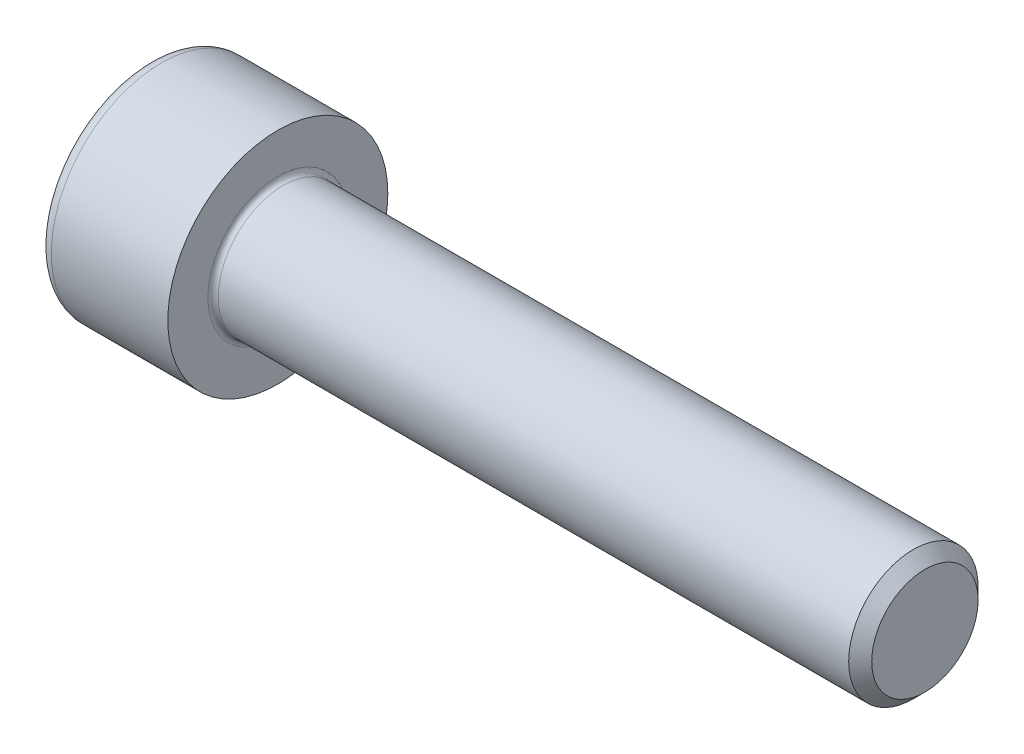
ISO-10303-21;
HEADER;
FILE_DESCRIPTION(('STEP AP214'),'2;1');
FILE_NAME('part.step','',(''),(''),'','','');
FILE_SCHEMA(('AUTOMOTIVE_DESIGN { 1 0 10303 214 1 1 1 1 }'));
ENDSEC;
DATA;
#1=APPLICATION_CONTEXT('core data for automotive mechanical design processes');
#2=APPLICATION_PROTOCOL_DEFINITION('international standard','automotive_design',2000,#1);
#3=PRODUCT_CONTEXT('',#1,'mechanical');
#4=PRODUCT('Part','Part','',(#3));
#5=PRODUCT_RELATED_PRODUCT_CATEGORY('part','',(#4));
#6=PRODUCT_DEFINITION_FORMATION('','',#4);
#7=PRODUCT_DEFINITION_CONTEXT('part definition',#1,'design');
#8=PRODUCT_DEFINITION('design','',#6,#7);
#9=PRODUCT_DEFINITION_SHAPE('','',#8);
#10=(LENGTH_UNIT() NAMED_UNIT(*) SI_UNIT(.MILLI.,.METRE.));
#11=(NAMED_UNIT(*) PLANE_ANGLE_UNIT() SI_UNIT($,.RADIAN.));
#12=(NAMED_UNIT(*) SI_UNIT($,.STERADIAN.) SOLID_ANGLE_UNIT());
#13=UNCERTAINTY_MEASURE_WITH_UNIT(LENGTH_MEASURE(1.E-05),#10,'distance_accuracy_value','');
#14=(GEOMETRIC_REPRESENTATION_CONTEXT(3) GLOBAL_UNCERTAINTY_ASSIGNED_CONTEXT((#13)) GLOBAL_UNIT_ASSIGNED_CONTEXT((#10,
#11,#12)) REPRESENTATION_CONTEXT('',''));
#15=CARTESIAN_POINT('',(0.,0.,0.));
#16=DIRECTION('',(0.,0.,1.));
#17=DIRECTION('',(1.,0.,0.));
#18=AXIS2_PLACEMENT_3D('',#15,#16,#17);
#19=CARTESIAN_POINT('',(2.5,3.46410161513776,2.));
#20=DIRECTION('',(1.,0.,0.));
#21=DIRECTION('',(0.,0.,-1.));
#22=AXIS2_PLACEMENT_3D('',#19,#20,#21);
#23=PLANE('',#22);
#24=CARTESIAN_POINT('',(2.5,0.,0.));
#25=DIRECTION('',(1.,0.,0.));
#26=DIRECTION('',(0.,0.,-1.));
#27=AXIS2_PLACEMENT_3D('',#24,#25,#26);
#28=CIRCLE('',#27,2.);
#29=CARTESIAN_POINT('',(2.5,0.,-2.));
#30=VERTEX_POINT('',#29);
#31=CARTESIAN_POINT('',(2.5,-1.73205080756888,-0.999999999999999));
#32=VERTEX_POINT('',#31);
#33=EDGE_CURVE('E157',#30,#32,#28,.F.);
#34=ORIENTED_EDGE('',*,*,#33,.F.);
#35=DIRECTION('',(0.,1.,0.));
#36=VECTOR('',#35,1.);
#37=CARTESIAN_POINT('',(2.5,-1.15470053837925,-2.));
#38=LINE('',#37,#36);
#39=CARTESIAN_POINT('',(2.5,-1.15470053837925,-2.));
#40=VERTEX_POINT('',#39);
#41=EDGE_CURVE('E188',#40,#30,#38,.T.);
#42=ORIENTED_EDGE('',*,*,#41,.F.);
#43=DIRECTION('',(0.,0.5,-0.866025403784439));
#44=VECTOR('',#43,1.);
#45=CARTESIAN_POINT('',(2.5,-2.3094010767585,0.));
#46=LINE('',#45,#44);
#47=EDGE_CURVE('E184',#32,#40,#46,.T.);
#48=ORIENTED_EDGE('',*,*,#47,.F.);
#49=EDGE_LOOP('',(#34,#42,#48));
#50=FACE_BOUND('',#49,.T.);
#51=ADVANCED_FACE('F35',(#50),#23,.F.);
#52=CARTESIAN_POINT('',(2.5,-1.73205080756888,1.));
#53=VERTEX_POINT('',#52);
#54=EDGE_CURVE('E263',#32,#53,#28,.F.);
#55=ORIENTED_EDGE('',*,*,#54,.F.);
#56=CARTESIAN_POINT('',(2.5,-2.3094010767585,0.));
#57=VERTEX_POINT('',#56);
#58=EDGE_CURVE('E185',#57,#32,#46,.T.);
#59=ORIENTED_EDGE('',*,*,#58,.F.);
#60=DIRECTION('',(0.,-0.5,-0.866025403784439));
#61=VECTOR('',#60,1.);
#62=CARTESIAN_POINT('',(2.5,-1.15470053837925,2.));
#63=LINE('',#62,#61);
#64=EDGE_CURVE('E180',#53,#57,#63,.T.);
#65=ORIENTED_EDGE('',*,*,#64,.F.);
#66=EDGE_LOOP('',(#55,#59,#65));
#67=FACE_BOUND('',#66,.T.);
#68=ADVANCED_FACE('F123',(#67),#23,.F.);
#69=CARTESIAN_POINT('',(2.5,0.,2.));
#70=VERTEX_POINT('',#69);
#71=EDGE_CURVE('E264',#53,#70,#28,.F.);
#72=ORIENTED_EDGE('',*,*,#71,.F.);
#73=CARTESIAN_POINT('',(2.5,-1.15470053837925,2.));
#74=VERTEX_POINT('',#73);
#75=EDGE_CURVE('E181',#74,#53,#63,.T.);
#76=ORIENTED_EDGE('',*,*,#75,.F.);
#77=DIRECTION('',(0.,-1.,0.));
#78=VECTOR('',#77,1.);
#79=CARTESIAN_POINT('',(2.5,1.15470053837925,2.));
#80=LINE('',#79,#78);
#81=EDGE_CURVE('E176',#70,#74,#80,.T.);
#82=ORIENTED_EDGE('',*,*,#81,.F.);
#83=EDGE_LOOP('',(#72,#76,#82));
#84=FACE_BOUND('',#83,.T.);
#85=ADVANCED_FACE('F130',(#84),#23,.F.);
#86=CARTESIAN_POINT('',(2.5,1.73205080756888,1.));
#87=VERTEX_POINT('',#86);
#88=EDGE_CURVE('E266',#70,#87,#28,.F.);
#89=ORIENTED_EDGE('',*,*,#88,.F.);
#90=CARTESIAN_POINT('',(2.5,1.15470053837925,2.));
#91=VERTEX_POINT('',#90);
#92=EDGE_CURVE('E177',#91,#70,#80,.T.);
#93=ORIENTED_EDGE('',*,*,#92,.F.);
#94=DIRECTION('',(0.,-0.5,0.866025403784439));
#95=VECTOR('',#94,1.);
#96=CARTESIAN_POINT('',(2.5,2.3094010767585,0.));
#97=LINE('',#96,#95);
#98=EDGE_CURVE('E171',#87,#91,#97,.T.);
#99=ORIENTED_EDGE('',*,*,#98,.F.);
#100=EDGE_LOOP('',(#89,#93,#99));
#101=FACE_BOUND('',#100,.T.);
#102=ADVANCED_FACE('F145',(#101),#23,.F.);
#103=CARTESIAN_POINT('',(2.5,1.73205080756888,-1.));
#104=VERTEX_POINT('',#103);
#105=EDGE_CURVE('E50',#87,#104,#28,.F.);
#106=ORIENTED_EDGE('',*,*,#105,.F.);
#107=CARTESIAN_POINT('',(2.5,2.3094010767585,0.));
#108=VERTEX_POINT('',#107);
#109=EDGE_CURVE('E162',#108,#87,#97,.T.);
#110=ORIENTED_EDGE('',*,*,#109,.F.);
#111=DIRECTION('',(0.,0.5,0.866025403784439));
#112=VECTOR('',#111,1.);
#113=CARTESIAN_POINT('',(2.5,1.15470053837925,-2.));
#114=LINE('',#113,#112);
#115=EDGE_CURVE('E159',#104,#108,#114,.T.);
#116=ORIENTED_EDGE('',*,*,#115,.F.);
#117=EDGE_LOOP('',(#106,#110,#116));
#118=FACE_BOUND('',#117,.T.);
#119=ADVANCED_FACE('F136',(#118),#23,.F.);
#120=EDGE_CURVE('E149',#104,#30,#28,.F.);
#121=ORIENTED_EDGE('',*,*,#120,.F.);
#122=CARTESIAN_POINT('',(2.5,1.15470053837925,-2.));
#123=VERTEX_POINT('',#122);
#124=EDGE_CURVE('E152',#123,#104,#114,.T.);
#125=ORIENTED_EDGE('',*,*,#124,.F.);
#126=EDGE_CURVE('E153',#30,#123,#38,.T.);
#127=ORIENTED_EDGE('',*,*,#126,.F.);
#128=EDGE_LOOP('',(#121,#125,#127));
#129=FACE_BOUND('',#128,.T.);
#130=ADVANCED_FACE('F126',(#129),#23,.F.);
#131=CARTESIAN_POINT('',(0.,0.,0.));
#132=DIRECTION('',(1.,0.,0.));
#133=DIRECTION('',(0.,0.,-1.));
#134=AXIS2_PLACEMENT_3D('',#131,#132,#133);
#135=PLANE('',#134);
#136=CARTESIAN_POINT('',(0.,0.,0.));
#137=DIRECTION('',(1.,0.,0.));
#138=DIRECTION('',(0.,0.,-1.));
#139=AXIS2_PLACEMENT_3D('',#136,#137,#138);
#140=CIRCLE('',#139,3.75);
#141=CARTESIAN_POINT('',(0.,0.,-3.75));
#142=VERTEX_POINT('',#141);
#143=EDGE_CURVE('E11',#142,#142,#140,.F.);
#144=ORIENTED_EDGE('',*,*,#143,.T.);
#145=EDGE_LOOP('',(#144));
#146=FACE_BOUND('',#145,.T.);
#147=DIRECTION('',(0.,0.5,0.866025403784439));
#148=VECTOR('',#147,1.);
#149=CARTESIAN_POINT('',(0.,1.15470053837925,-2.));
#150=LINE('',#149,#148);
#151=CARTESIAN_POINT('',(0.,1.15470053837925,-2.));
#152=VERTEX_POINT('',#151);
#153=CARTESIAN_POINT('',(0.,2.3094010767585,0.));
#154=VERTEX_POINT('',#153);
#155=EDGE_CURVE('E190',#152,#154,#150,.T.);
#156=ORIENTED_EDGE('',*,*,#155,.T.);
#157=DIRECTION('',(0.,-0.5,0.866025403784439));
#158=VECTOR('',#157,1.);
#159=CARTESIAN_POINT('',(0.,2.3094010767585,0.));
#160=LINE('',#159,#158);
#161=CARTESIAN_POINT('',(0.,1.15470053837925,2.));
#162=VERTEX_POINT('',#161);
#163=EDGE_CURVE('E192',#154,#162,#160,.T.);
#164=ORIENTED_EDGE('',*,*,#163,.T.);
#165=DIRECTION('',(0.,-1.,0.));
#166=VECTOR('',#165,1.);
#167=CARTESIAN_POINT('',(0.,1.15470053837925,2.));
#168=LINE('',#167,#166);
#169=CARTESIAN_POINT('',(0.,-1.15470053837925,2.));
#170=VERTEX_POINT('',#169);
#171=EDGE_CURVE('E194',#162,#170,#168,.T.);
#172=ORIENTED_EDGE('',*,*,#171,.T.);
#173=DIRECTION('',(0.,-0.5,-0.866025403784439));
#174=VECTOR('',#173,1.);
#175=CARTESIAN_POINT('',(0.,-1.15470053837925,2.));
#176=LINE('',#175,#174);
#177=CARTESIAN_POINT('',(0.,-2.3094010767585,0.));
#178=VERTEX_POINT('',#177);
#179=EDGE_CURVE('E196',#170,#178,#176,.T.);
#180=ORIENTED_EDGE('',*,*,#179,.T.);
#181=DIRECTION('',(0.,0.5,-0.866025403784439));
#182=VECTOR('',#181,1.);
#183=CARTESIAN_POINT('',(0.,-2.3094010767585,0.));
#184=LINE('',#183,#182);
#185=CARTESIAN_POINT('',(0.,-1.15470053837925,-2.));
#186=VERTEX_POINT('',#185);
#187=EDGE_CURVE('E198',#178,#186,#184,.T.);
#188=ORIENTED_EDGE('',*,*,#187,.T.);
#189=DIRECTION('',(0.,1.,0.));
#190=VECTOR('',#189,1.);
#191=CARTESIAN_POINT('',(0.,-1.15470053837925,-2.));
#192=LINE('',#191,#190);
#193=EDGE_CURVE('E58',#186,#152,#192,.T.);
#194=ORIENTED_EDGE('',*,*,#193,.T.);
#195=EDGE_LOOP('',(#156,#164,#172,#180,#188,#194));
#196=FACE_BOUND('',#195,.T.);
#197=ADVANCED_FACE('F135',(#146,#196),#135,.F.);
#198=CARTESIAN_POINT('',(5.,0.,0.));
#199=DIRECTION('',(1.,0.,0.));
#200=DIRECTION('',(0.,0.,-1.));
#201=AXIS2_PLACEMENT_3D('',#198,#199,#200);
#202=PLANE('',#201);
#203=CARTESIAN_POINT('',(5.,0.,0.));
#204=DIRECTION('',(1.,0.,0.));
#205=DIRECTION('',(0.,0.,-1.));
#206=AXIS2_PLACEMENT_3D('',#203,#204,#205);
#207=CIRCLE('',#206,2.7);
#208=CARTESIAN_POINT('',(5.,0.,-2.7));
#209=VERTEX_POINT('',#208);
#210=EDGE_CURVE('E224',#209,#209,#207,.F.);
#211=ORIENTED_EDGE('',*,*,#210,.T.);
#212=EDGE_LOOP('',(#211));
#213=FACE_BOUND('',#212,.T.);
#214=CARTESIAN_POINT('',(5.,0.,0.));
#215=DIRECTION('',(1.,0.,0.));
#216=DIRECTION('',(0.,0.,-1.));
#217=AXIS2_PLACEMENT_3D('',#214,#215,#216);
#218=CIRCLE('',#217,4.25);
#219=CARTESIAN_POINT('',(5.,0.,-4.25));
#220=VERTEX_POINT('',#219);
#221=EDGE_CURVE('E155',#220,#220,#218,.T.);
#222=ORIENTED_EDGE('',*,*,#221,.T.);
#223=EDGE_LOOP('',(#222));
#224=FACE_BOUND('',#223,.T.);
#225=ADVANCED_FACE('F142',(#213,#224),#202,.T.);
#226=CARTESIAN_POINT('',(5.,0.,0.));
#227=DIRECTION('',(-1.,0.,0.));
#228=DIRECTION('',(0.,0.,1.));
#229=AXIS2_PLACEMENT_3D('',#226,#227,#228);
#230=CYLINDRICAL_SURFACE('',#229,4.25);
#231=CARTESIAN_POINT('',(0.5,0.,0.));
#232=DIRECTION('',(1.,0.,0.));
#233=DIRECTION('',(0.,0.,-1.));
#234=AXIS2_PLACEMENT_3D('',#231,#232,#233);
#235=CIRCLE('',#234,4.25);
#236=CARTESIAN_POINT('',(0.5,0.,-4.25));
#237=VERTEX_POINT('',#236);
#238=EDGE_CURVE('E43',#237,#237,#235,.T.);
#239=ORIENTED_EDGE('',*,*,#238,.T.);
#240=EDGE_LOOP('',(#239));
#241=FACE_BOUND('',#240,.T.);
#242=ORIENTED_EDGE('',*,*,#221,.F.);
#243=EDGE_LOOP('',(#242));
#244=FACE_BOUND('',#243,.T.);
#245=ADVANCED_FACE('F232',(#241,#244),#230,.T.);
#246=CARTESIAN_POINT('',(30.,0.,0.));
#247=DIRECTION('',(-1.,0.,0.));
#248=DIRECTION('',(0.,0.,1.));
#249=AXIS2_PLACEMENT_3D('',#246,#247,#248);
#250=PLANE('',#249);
#251=CARTESIAN_POINT('',(30.,0.,0.));
#252=DIRECTION('',(-1.,0.,0.));
#253=DIRECTION('',(0.,0.,1.));
#254=AXIS2_PLACEMENT_3D('',#251,#252,#253);
#255=CIRCLE('',#254,2.055);
#256=CARTESIAN_POINT('',(30.,0.,2.055));
#257=VERTEX_POINT('',#256);
#258=EDGE_CURVE('E219',#257,#257,#255,.T.);
#259=ORIENTED_EDGE('',*,*,#258,.F.);
#260=EDGE_LOOP('',(#259));
#261=FACE_BOUND('',#260,.T.);
#262=ADVANCED_FACE('F389',(#261),#250,.F.);
#263=CARTESIAN_POINT('',(30.,0.,0.));
#264=DIRECTION('',(-1.,0.,0.));
#265=DIRECTION('',(0.,0.,1.));
#266=AXIS2_PLACEMENT_3D('',#263,#264,#265);
#267=CONICAL_SURFACE('',#266,2.055,0.785398163397445);
#268=CARTESIAN_POINT('',(29.555,0.,0.));
#269=DIRECTION('',(-1.,0.,0.));
#270=DIRECTION('',(0.,0.,1.));
#271=AXIS2_PLACEMENT_3D('',#268,#269,#270);
#272=CIRCLE('',#271,2.5);
#273=CARTESIAN_POINT('',(29.555,0.,2.5));
#274=VERTEX_POINT('',#273);
#275=EDGE_CURVE('E216',#274,#274,#272,.T.);
#276=ORIENTED_EDGE('',*,*,#275,.F.);
#277=EDGE_LOOP('',(#276));
#278=FACE_BOUND('',#277,.T.);
#279=ORIENTED_EDGE('',*,*,#258,.T.);
#280=EDGE_LOOP('',(#279));
#281=FACE_BOUND('',#280,.T.);
#282=ADVANCED_FACE('F369',(#278,#281),#267,.T.);
#283=CARTESIAN_POINT('',(0.,0.,0.));
#284=DIRECTION('',(-1.,0.,0.));
#285=DIRECTION('',(0.,0.,1.));
#286=AXIS2_PLACEMENT_3D('',#283,#284,#285);
#287=CYLINDRICAL_SURFACE('',#286,2.5);
#288=CARTESIAN_POINT('',(5.2,0.,0.));
#289=DIRECTION('',(1.,0.,0.));
#290=DIRECTION('',(0.,0.,-1.));
#291=AXIS2_PLACEMENT_3D('',#288,#289,#290);
#292=CIRCLE('',#291,2.5);
#293=CARTESIAN_POINT('',(5.2,0.,-2.5));
#294=VERTEX_POINT('',#293);
#295=EDGE_CURVE('E227',#294,#294,#292,.T.);
#296=ORIENTED_EDGE('',*,*,#295,.T.);
#297=EDGE_LOOP('',(#296));
#298=FACE_BOUND('',#297,.T.);
#299=ORIENTED_EDGE('',*,*,#275,.T.);
#300=EDGE_LOOP('',(#299));
#301=FACE_BOUND('',#300,.T.);
#302=ADVANCED_FACE('F296',(#298,#301),#287,.T.);
#303=CARTESIAN_POINT('',(2.5,1.15470053837925,-2.));
#304=DIRECTION('',(0.,-0.866025403784439,0.5));
#305=DIRECTION('',(0.,-0.5,-0.866025403784439));
#306=AXIS2_PLACEMENT_3D('',#303,#304,#305);
#307=PLANE('',#306);
#308=ORIENTED_EDGE('',*,*,#124,.T.);
#309=ORIENTED_EDGE('',*,*,#115,.T.);
#310=DIRECTION('',(-1.,0.,0.));
#311=VECTOR('',#310,1.);
#312=CARTESIAN_POINT('',(2.5,2.3094010767585,0.));
#313=LINE('',#312,#311);
#314=EDGE_CURVE('E214',#108,#154,#313,.T.);
#315=ORIENTED_EDGE('',*,*,#314,.T.);
#316=ORIENTED_EDGE('',*,*,#155,.F.);
#317=DIRECTION('',(-1.,0.,0.));
#318=VECTOR('',#317,1.);
#319=CARTESIAN_POINT('',(2.5,1.15470053837925,-2.));
#320=LINE('',#319,#318);
#321=EDGE_CURVE('E170',#123,#152,#320,.T.);
#322=ORIENTED_EDGE('',*,*,#321,.F.);
#323=EDGE_LOOP('',(#308,#309,#315,#316,#322));
#324=FACE_BOUND('',#323,.T.);
#325=ADVANCED_FACE('F168',(#324),#307,.T.);
#326=CARTESIAN_POINT('',(2.5,2.3094010767585,0.));
#327=DIRECTION('',(0.,-0.866025403784439,-0.5));
#328=DIRECTION('',(0.,0.5,-0.866025403784439));
#329=AXIS2_PLACEMENT_3D('',#326,#327,#328);
#330=PLANE('',#329);
#331=ORIENTED_EDGE('',*,*,#109,.T.);
#332=ORIENTED_EDGE('',*,*,#98,.T.);
#333=DIRECTION('',(-1.,0.,0.));
#334=VECTOR('',#333,1.);
#335=CARTESIAN_POINT('',(2.5,1.15470053837925,2.));
#336=LINE('',#335,#334);
#337=EDGE_CURVE('E211',#91,#162,#336,.T.);
#338=ORIENTED_EDGE('',*,*,#337,.T.);
#339=ORIENTED_EDGE('',*,*,#163,.F.);
#340=ORIENTED_EDGE('',*,*,#314,.F.);
#341=EDGE_LOOP('',(#331,#332,#338,#339,#340));
#342=FACE_BOUND('',#341,.T.);
#343=ADVANCED_FACE('F242',(#342),#330,.T.);
#344=CARTESIAN_POINT('',(2.5,1.15470053837925,2.));
#345=DIRECTION('',(0.,0.,-1.));
#346=DIRECTION('',(-1.,0.,0.));
#347=AXIS2_PLACEMENT_3D('',#344,#345,#346);
#348=PLANE('',#347);
#349=ORIENTED_EDGE('',*,*,#92,.T.);
#350=ORIENTED_EDGE('',*,*,#81,.T.);
#351=DIRECTION('',(-1.,0.,0.));
#352=VECTOR('',#351,1.);
#353=CARTESIAN_POINT('',(2.5,-1.15470053837925,2.));
#354=LINE('',#353,#352);
#355=EDGE_CURVE('E208',#74,#170,#354,.T.);
#356=ORIENTED_EDGE('',*,*,#355,.T.);
#357=ORIENTED_EDGE('',*,*,#171,.F.);
#358=ORIENTED_EDGE('',*,*,#337,.F.);
#359=EDGE_LOOP('',(#349,#350,#356,#357,#358));
#360=FACE_BOUND('',#359,.T.);
#361=ADVANCED_FACE('F247',(#360),#348,.T.);
#362=CARTESIAN_POINT('',(2.5,-1.15470053837925,2.));
#363=DIRECTION('',(0.,0.866025403784439,-0.5));
#364=DIRECTION('',(0.,0.5,0.866025403784439));
#365=AXIS2_PLACEMENT_3D('',#362,#363,#364);
#366=PLANE('',#365);
#367=ORIENTED_EDGE('',*,*,#75,.T.);
#368=ORIENTED_EDGE('',*,*,#64,.T.);
#369=DIRECTION('',(-1.,0.,0.));
#370=VECTOR('',#369,1.);
#371=CARTESIAN_POINT('',(2.5,-2.3094010767585,0.));
#372=LINE('',#371,#370);
#373=EDGE_CURVE('E205',#57,#178,#372,.T.);
#374=ORIENTED_EDGE('',*,*,#373,.T.);
#375=ORIENTED_EDGE('',*,*,#179,.F.);
#376=ORIENTED_EDGE('',*,*,#355,.F.);
#377=EDGE_LOOP('',(#367,#368,#374,#375,#376));
#378=FACE_BOUND('',#377,.T.);
#379=ADVANCED_FACE('F253',(#378),#366,.T.);
#380=CARTESIAN_POINT('',(2.5,-2.3094010767585,0.));
#381=DIRECTION('',(0.,0.866025403784439,0.5));
#382=DIRECTION('',(0.,-0.5,0.866025403784439));
#383=AXIS2_PLACEMENT_3D('',#380,#381,#382);
#384=PLANE('',#383);
#385=ORIENTED_EDGE('',*,*,#58,.T.);
#386=ORIENTED_EDGE('',*,*,#47,.T.);
#387=DIRECTION('',(-1.,0.,0.));
#388=VECTOR('',#387,1.);
#389=CARTESIAN_POINT('',(2.5,-1.15470053837925,-2.));
#390=LINE('',#389,#388);
#391=EDGE_CURVE('E202',#40,#186,#390,.T.);
#392=ORIENTED_EDGE('',*,*,#391,.T.);
#393=ORIENTED_EDGE('',*,*,#187,.F.);
#394=ORIENTED_EDGE('',*,*,#373,.F.);
#395=EDGE_LOOP('',(#385,#386,#392,#393,#394));
#396=FACE_BOUND('',#395,.T.);
#397=ADVANCED_FACE('F257',(#396),#384,.T.);
#398=CARTESIAN_POINT('',(2.5,-1.15470053837925,-2.));
#399=DIRECTION('',(0.,0.,1.));
#400=DIRECTION('',(0.,-1.,0.));
#401=AXIS2_PLACEMENT_3D('',#398,#399,#400);
#402=PLANE('',#401);
#403=ORIENTED_EDGE('',*,*,#41,.T.);
#404=ORIENTED_EDGE('',*,*,#126,.T.);
#405=ORIENTED_EDGE('',*,*,#321,.T.);
#406=ORIENTED_EDGE('',*,*,#193,.F.);
#407=ORIENTED_EDGE('',*,*,#391,.F.);
#408=EDGE_LOOP('',(#403,#404,#405,#406,#407));
#409=FACE_BOUND('',#408,.T.);
#410=ADVANCED_FACE('F118',(#409),#402,.T.);
#411=CARTESIAN_POINT('',(0.,0.,0.));
#412=DIRECTION('',(-1.,0.,0.));
#413=DIRECTION('',(0.,0.,1.));
#414=AXIS2_PLACEMENT_3D('',#411,#412,#413);
#415=CYLINDRICAL_SURFACE('',#414,2.);
#416=CARTESIAN_POINT('',(3.1,0.,0.));
#417=DIRECTION('',(-1.,0.,0.));
#418=DIRECTION('',(0.,0.,1.));
#419=AXIS2_PLACEMENT_3D('',#416,#417,#418);
#420=CIRCLE('',#419,2.);
#421=CARTESIAN_POINT('',(3.1,0.,2.));
#422=VERTEX_POINT('',#421);
#423=EDGE_CURVE('E174',#422,#422,#420,.T.);
#424=ORIENTED_EDGE('',*,*,#423,.F.);
#425=EDGE_LOOP('',(#424));
#426=FACE_BOUND('',#425,.T.);
#427=ORIENTED_EDGE('',*,*,#33,.T.);
#428=ORIENTED_EDGE('',*,*,#54,.T.);
#429=ORIENTED_EDGE('',*,*,#71,.T.);
#430=ORIENTED_EDGE('',*,*,#88,.T.);
#431=ORIENTED_EDGE('',*,*,#105,.T.);
#432=ORIENTED_EDGE('',*,*,#120,.T.);
#433=EDGE_LOOP('',(#427,#428,#429,#430,#431,#432));
#434=FACE_BOUND('',#433,.T.);
#435=ADVANCED_FACE('F110',(#426,#434),#415,.F.);
#436=CARTESIAN_POINT('',(4.25470053837927,0.,0.));
#437=DIRECTION('',(-1.,0.,0.));
#438=DIRECTION('',(0.,0.,1.));
#439=AXIS2_PLACEMENT_3D('',#436,#437,#438);
#440=CONICAL_SURFACE('',#439,0.,1.04719755119659);
#441=ORIENTED_EDGE('',*,*,#423,.T.);
#442=EDGE_LOOP('',(#441));
#443=FACE_BOUND('',#442,.T.);
#444=CARTESIAN_POINT('',(4.25470053837927,0.,0.));
#445=VERTEX_POINT('',#444);
#446=VERTEX_LOOP('',#445);
#447=FACE_BOUND('',#446,.T.);
#448=ADVANCED_FACE('F107',(#443,#447),#440,.F.);
#449=CARTESIAN_POINT('',(5.2,0.,0.));
#450=DIRECTION('',(1.,0.,0.));
#451=DIRECTION('',(0.,0.,-1.));
#452=AXIS2_PLACEMENT_3D('',#449,#450,#451);
#453=TOROIDAL_SURFACE('',#452,2.7,0.2);
#454=ORIENTED_EDGE('',*,*,#295,.F.);
#455=EDGE_LOOP('',(#454));
#456=FACE_BOUND('',#455,.T.);
#457=ORIENTED_EDGE('',*,*,#210,.F.);
#458=EDGE_LOOP('',(#457));
#459=FACE_BOUND('',#458,.T.);
#460=ADVANCED_FACE('F109',(#456,#459),#453,.F.);
#461=CARTESIAN_POINT('',(0.5,0.,0.));
#462=DIRECTION('',(1.,0.,0.));
#463=DIRECTION('',(0.,0.,-1.));
#464=AXIS2_PLACEMENT_3D('',#461,#462,#463);
#465=TOROIDAL_SURFACE('',#464,3.75,0.5);
#466=ORIENTED_EDGE('',*,*,#143,.F.);
#467=EDGE_LOOP('',(#466));
#468=FACE_BOUND('',#467,.T.);
#469=ORIENTED_EDGE('',*,*,#238,.F.);
#470=EDGE_LOOP('',(#469));
#471=FACE_BOUND('',#470,.T.);
#472=ADVANCED_FACE('F37',(#468,#471),#465,.T.);
#473=CLOSED_SHELL('',(#51,#68,#85,#102,#119,#130,#197,#225,#245,#262,#282,#302,#325,#343,#361,
#379,#397,#410,#435,#448,#460,#472));
#474=MANIFOLD_SOLID_BREP('B2',#473);
#475=ADVANCED_BREP_SHAPE_REPRESENTATION('',(#18,#474),#14);
#476=SHAPE_DEFINITION_REPRESENTATION(#9,#475);
ENDSEC;
END-ISO-10303-21;
